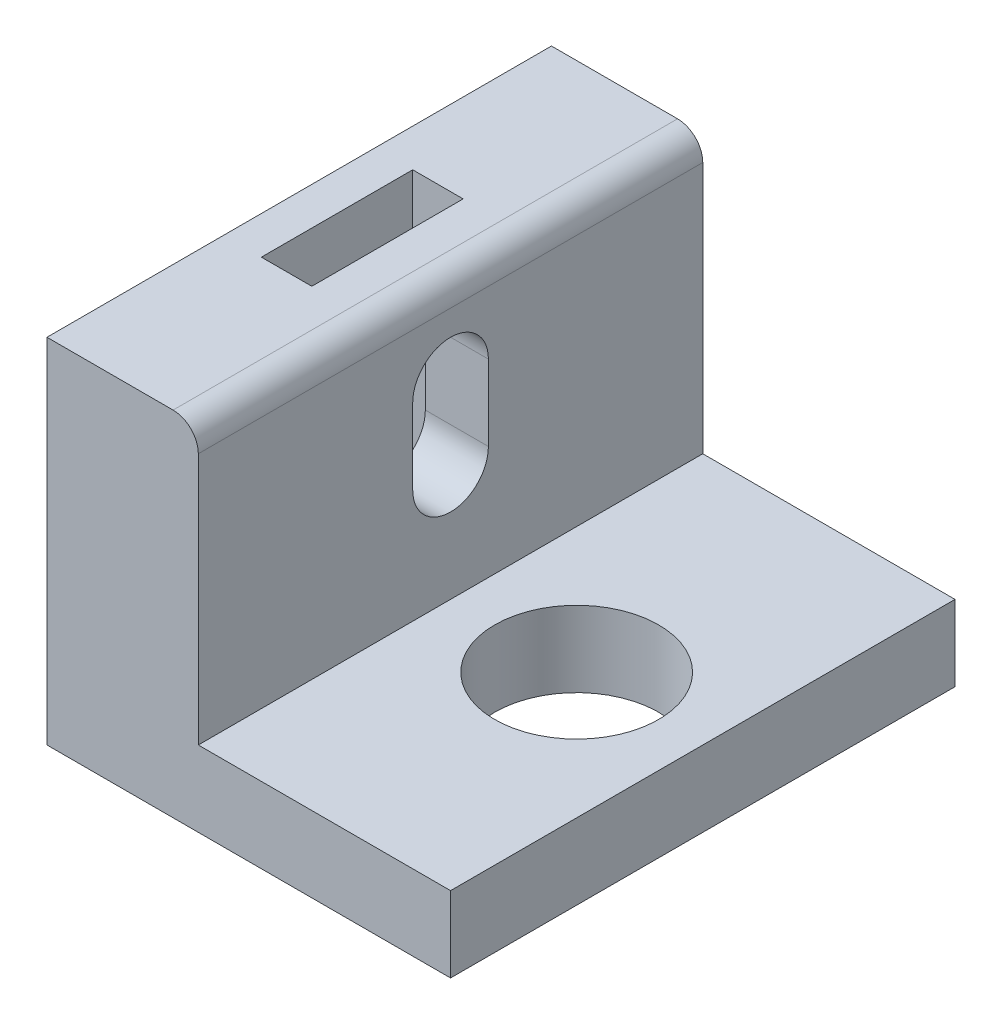
ISO-10303-21;
HEADER;
FILE_DESCRIPTION(('STEP AP214'),'2;1');
FILE_NAME('part.step','',(''),(''),'','','');
FILE_SCHEMA(('AUTOMOTIVE_DESIGN { 1 0 10303 214 1 1 1 1 }'));
ENDSEC;
DATA;
#1=APPLICATION_CONTEXT('core data for automotive mechanical design processes');
#2=APPLICATION_PROTOCOL_DEFINITION('international standard','automotive_design',2000,#1);
#3=PRODUCT_CONTEXT('',#1,'mechanical');
#4=PRODUCT('Part','Part','',(#3));
#5=PRODUCT_RELATED_PRODUCT_CATEGORY('part','',(#4));
#6=PRODUCT_DEFINITION_FORMATION('','',#4);
#7=PRODUCT_DEFINITION_CONTEXT('part definition',#1,'design');
#8=PRODUCT_DEFINITION('design','',#6,#7);
#9=PRODUCT_DEFINITION_SHAPE('','',#8);
#10=(LENGTH_UNIT() NAMED_UNIT(*) SI_UNIT(.MILLI.,.METRE.));
#11=(NAMED_UNIT(*) PLANE_ANGLE_UNIT() SI_UNIT($,.RADIAN.));
#12=(NAMED_UNIT(*) SI_UNIT($,.STERADIAN.) SOLID_ANGLE_UNIT());
#13=UNCERTAINTY_MEASURE_WITH_UNIT(LENGTH_MEASURE(1.E-05),#10,'distance_accuracy_value','');
#14=(GEOMETRIC_REPRESENTATION_CONTEXT(3) GLOBAL_UNCERTAINTY_ASSIGNED_CONTEXT((#13)) GLOBAL_UNIT_ASSIGNED_CONTEXT((#10,
#11,#12)) REPRESENTATION_CONTEXT('',''));
#15=CARTESIAN_POINT('',(0.,0.,0.));
#16=DIRECTION('',(0.,0.,1.));
#17=DIRECTION('',(1.,0.,0.));
#18=AXIS2_PLACEMENT_3D('',#15,#16,#17);
#19=CARTESIAN_POINT('',(7.501,20.,-10.));
#20=DIRECTION('',(-1.,0.,0.));
#21=DIRECTION('',(0.,0.,1.));
#22=AXIS2_PLACEMENT_3D('',#19,#20,#21);
#23=CYLINDRICAL_SURFACE('',#22,1.5);
#24=DIRECTION('',(-1.,0.,0.));
#25=VECTOR('',#24,1.);
#26=CARTESIAN_POINT('',(7.501,20.,-11.5));
#27=LINE('',#26,#25);
#28=CARTESIAN_POINT('',(-9.5,20.,-11.5));
#29=VERTEX_POINT('',#28);
#30=CARTESIAN_POINT('',(-11.,20.,-11.5));
#31=VERTEX_POINT('',#30);
#32=EDGE_CURVE('E199',#29,#31,#27,.T.);
#33=ORIENTED_EDGE('',*,*,#32,.F.);
#34=CARTESIAN_POINT('',(-9.5,20.,-10.));
#35=DIRECTION('',(-1.,0.,0.));
#36=DIRECTION('',(0.,0.,1.));
#37=AXIS2_PLACEMENT_3D('',#34,#35,#36);
#38=CIRCLE('',#37,1.5);
#39=CARTESIAN_POINT('',(-9.5,20.,-8.5));
#40=VERTEX_POINT('',#39);
#41=EDGE_CURVE('E194',#29,#40,#38,.F.);
#42=ORIENTED_EDGE('',*,*,#41,.T.);
#43=DIRECTION('',(-1.,0.,0.));
#44=VECTOR('',#43,1.);
#45=CARTESIAN_POINT('',(7.501,20.,-8.5));
#46=LINE('',#45,#44);
#47=CARTESIAN_POINT('',(-11.,20.,-8.5));
#48=VERTEX_POINT('',#47);
#49=EDGE_CURVE('E264',#40,#48,#46,.T.);
#50=ORIENTED_EDGE('',*,*,#49,.T.);
#51=CARTESIAN_POINT('',(-11.,20.,-10.));
#52=DIRECTION('',(-1.,0.,0.));
#53=DIRECTION('',(0.,0.,1.));
#54=AXIS2_PLACEMENT_3D('',#51,#52,#53);
#55=CIRCLE('',#54,1.5);
#56=EDGE_CURVE('E273',#48,#31,#55,.T.);
#57=ORIENTED_EDGE('',*,*,#56,.T.);
#58=EDGE_LOOP('',(#33,#42,#50,#57));
#59=FACE_BOUND('',#58,.T.);
#60=ADVANCED_FACE('F35',(#59),#23,.F.);
#61=CARTESIAN_POINT('',(7.501,20.,-8.5));
#62=DIRECTION('',(0.,0.,1.));
#63=DIRECTION('',(0.,-1.,0.));
#64=AXIS2_PLACEMENT_3D('',#61,#62,#63);
#65=PLANE('',#64);
#66=ORIENTED_EDGE('',*,*,#49,.F.);
#67=DIRECTION('',(0.,-1.,0.));
#68=VECTOR('',#67,1.);
#69=CARTESIAN_POINT('',(-9.5,20.,-8.5));
#70=LINE('',#69,#68);
#71=CARTESIAN_POINT('',(-9.5,17.,-8.49999999999999));
#72=VERTEX_POINT('',#71);
#73=EDGE_CURVE('E276',#40,#72,#70,.T.);
#74=ORIENTED_EDGE('',*,*,#73,.T.);
#75=DIRECTION('',(-1.,0.,0.));
#76=VECTOR('',#75,1.);
#77=CARTESIAN_POINT('',(7.501,17.,-8.5));
#78=LINE('',#77,#76);
#79=CARTESIAN_POINT('',(-11.,17.,-8.5));
#80=VERTEX_POINT('',#79);
#81=EDGE_CURVE('E261',#72,#80,#78,.T.);
#82=ORIENTED_EDGE('',*,*,#81,.T.);
#83=DIRECTION('',(0.,1.,0.));
#84=VECTOR('',#83,1.);
#85=CARTESIAN_POINT('',(-11.,20.,-8.5));
#86=LINE('',#85,#84);
#87=EDGE_CURVE('E265',#80,#48,#86,.T.);
#88=ORIENTED_EDGE('',*,*,#87,.T.);
#89=EDGE_LOOP('',(#66,#74,#82,#88));
#90=FACE_BOUND('',#89,.T.);
#91=ADVANCED_FACE('F362',(#90),#65,.F.);
#92=CARTESIAN_POINT('',(7.501,17.,-10.));
#93=DIRECTION('',(-1.,0.,0.));
#94=DIRECTION('',(0.,0.,1.));
#95=AXIS2_PLACEMENT_3D('',#92,#93,#94);
#96=CYLINDRICAL_SURFACE('',#95,1.5);
#97=ORIENTED_EDGE('',*,*,#81,.F.);
#98=CARTESIAN_POINT('',(-9.5,17.,-10.));
#99=DIRECTION('',(-1.,0.,0.));
#100=DIRECTION('',(0.,0.,1.));
#101=AXIS2_PLACEMENT_3D('',#98,#99,#100);
#102=CIRCLE('',#101,1.5);
#103=CARTESIAN_POINT('',(-9.5,17.,-11.5));
#104=VERTEX_POINT('',#103);
#105=EDGE_CURVE('E268',#72,#104,#102,.F.);
#106=ORIENTED_EDGE('',*,*,#105,.T.);
#107=DIRECTION('',(-1.,0.,0.));
#108=VECTOR('',#107,1.);
#109=CARTESIAN_POINT('',(7.501,17.,-11.5));
#110=LINE('',#109,#108);
#111=CARTESIAN_POINT('',(-11.,17.,-11.5));
#112=VERTEX_POINT('',#111);
#113=EDGE_CURVE('E256',#104,#112,#110,.T.);
#114=ORIENTED_EDGE('',*,*,#113,.T.);
#115=CARTESIAN_POINT('',(-11.,17.,-10.));
#116=DIRECTION('',(-1.,0.,0.));
#117=DIRECTION('',(0.,0.,1.));
#118=AXIS2_PLACEMENT_3D('',#115,#116,#117);
#119=CIRCLE('',#118,1.5);
#120=EDGE_CURVE('E200',#112,#80,#119,.T.);
#121=ORIENTED_EDGE('',*,*,#120,.T.);
#122=EDGE_LOOP('',(#97,#106,#114,#121));
#123=FACE_BOUND('',#122,.T.);
#124=ADVANCED_FACE('F367',(#123),#96,.F.);
#125=CARTESIAN_POINT('',(7.501,20.,-11.5));
#126=DIRECTION('',(0.,0.,-1.));
#127=DIRECTION('',(0.,1.,0.));
#128=AXIS2_PLACEMENT_3D('',#125,#126,#127);
#129=PLANE('',#128);
#130=ORIENTED_EDGE('',*,*,#113,.F.);
#131=DIRECTION('',(0.,1.,0.));
#132=VECTOR('',#131,1.);
#133=CARTESIAN_POINT('',(-9.5,20.,-11.5));
#134=LINE('',#133,#132);
#135=EDGE_CURVE('E196',#104,#29,#134,.T.);
#136=ORIENTED_EDGE('',*,*,#135,.T.);
#137=ORIENTED_EDGE('',*,*,#32,.T.);
#138=DIRECTION('',(0.,-1.,0.));
#139=VECTOR('',#138,1.);
#140=CARTESIAN_POINT('',(-11.,20.,-11.5));
#141=LINE('',#140,#139);
#142=EDGE_CURVE('E244',#31,#112,#141,.T.);
#143=ORIENTED_EDGE('',*,*,#142,.T.);
#144=EDGE_LOOP('',(#130,#136,#137,#143));
#145=FACE_BOUND('',#144,.T.);
#146=ADVANCED_FACE('F330',(#145),#129,.F.);
#147=CARTESIAN_POINT('',(-5.,12.5,-20.));
#148=DIRECTION('',(0.,1.,0.));
#149=DIRECTION('',(-1.,0.,0.));
#150=AXIS2_PLACEMENT_3D('',#147,#148,#149);
#151=PLANE('',#150);
#152=CARTESIAN_POINT('',(0.,12.5,-10.));
#153=DIRECTION('',(0.,1.,0.));
#154=DIRECTION('',(-1.,0.,0.));
#155=AXIS2_PLACEMENT_3D('',#152,#153,#154);
#156=CIRCLE('',#155,3.25);
#157=CARTESIAN_POINT('',(-3.25,12.5,-10.));
#158=VERTEX_POINT('',#157);
#159=EDGE_CURVE('E44',#158,#158,#156,.T.);
#160=ORIENTED_EDGE('',*,*,#159,.F.);
#161=EDGE_LOOP('',(#160));
#162=FACE_BOUND('',#161,.T.);
#163=DIRECTION('',(-1.,0.,0.));
#164=VECTOR('',#163,1.);
#165=CARTESIAN_POINT('',(-5.,12.5,0.));
#166=LINE('',#165,#164);
#167=CARTESIAN_POINT('',(5.00000000000001,12.5,0.));
#168=VERTEX_POINT('',#167);
#169=CARTESIAN_POINT('',(-5.,12.5,0.));
#170=VERTEX_POINT('',#169);
#171=EDGE_CURVE('E174',#168,#170,#166,.T.);
#172=ORIENTED_EDGE('',*,*,#171,.F.);
#173=DIRECTION('',(0.,0.,-1.));
#174=VECTOR('',#173,1.);
#175=CARTESIAN_POINT('',(5.,12.5,-20.));
#176=LINE('',#175,#174);
#177=CARTESIAN_POINT('',(5.,12.5,-20.));
#178=VERTEX_POINT('',#177);
#179=EDGE_CURVE('E183',#168,#178,#176,.T.);
#180=ORIENTED_EDGE('',*,*,#179,.T.);
#181=DIRECTION('',(-1.,0.,0.));
#182=VECTOR('',#181,1.);
#183=CARTESIAN_POINT('',(-5.,12.5,-20.));
#184=LINE('',#183,#182);
#185=CARTESIAN_POINT('',(-5.,12.5,-20.));
#186=VERTEX_POINT('',#185);
#187=EDGE_CURVE('E208',#178,#186,#184,.T.);
#188=ORIENTED_EDGE('',*,*,#187,.T.);
#189=DIRECTION('',(0.,0.,1.));
#190=VECTOR('',#189,1.);
#191=CARTESIAN_POINT('',(-5.,12.5,-20.));
#192=LINE('',#191,#190);
#193=EDGE_CURVE('E206',#186,#170,#192,.T.);
#194=ORIENTED_EDGE('',*,*,#193,.T.);
#195=EDGE_LOOP('',(#172,#180,#188,#194));
#196=FACE_BOUND('',#195,.T.);
#197=ADVANCED_FACE('F327',(#162,#196),#151,.T.);
#198=CARTESIAN_POINT('',(-4.00000000000456,9.5,-20.));
#199=DIRECTION('',(0.,-1.,0.));
#200=DIRECTION('',(0.,0.,-1.));
#201=AXIS2_PLACEMENT_3D('',#198,#199,#200);
#202=PLANE('',#201);
#203=DIRECTION('',(1.,0.,0.));
#204=VECTOR('',#203,1.);
#205=CARTESIAN_POINT('',(-4.00000000000456,9.5,0.));
#206=LINE('',#205,#204);
#207=CARTESIAN_POINT('',(-11.,9.5,0.));
#208=VERTEX_POINT('',#207);
#209=CARTESIAN_POINT('',(5.00000000000001,9.5,0.));
#210=VERTEX_POINT('',#209);
#211=EDGE_CURVE('E163',#208,#210,#206,.T.);
#212=ORIENTED_EDGE('',*,*,#211,.F.);
#213=DIRECTION('',(0.,0.,1.));
#214=VECTOR('',#213,1.);
#215=CARTESIAN_POINT('',(-11.,9.5,-20.));
#216=LINE('',#215,#214);
#217=CARTESIAN_POINT('',(-11.,9.5,-20.));
#218=VERTEX_POINT('',#217);
#219=EDGE_CURVE('E218',#218,#208,#216,.T.);
#220=ORIENTED_EDGE('',*,*,#219,.F.);
#221=DIRECTION('',(1.,0.,0.));
#222=VECTOR('',#221,1.);
#223=CARTESIAN_POINT('',(-4.00000000000456,9.5,-20.));
#224=LINE('',#223,#222);
#225=CARTESIAN_POINT('',(5.,9.5,-20.));
#226=VERTEX_POINT('',#225);
#227=EDGE_CURVE('E189',#218,#226,#224,.T.);
#228=ORIENTED_EDGE('',*,*,#227,.T.);
#229=DIRECTION('',(0.,0.,-1.));
#230=VECTOR('',#229,1.);
#231=CARTESIAN_POINT('',(5.,9.5,-20.));
#232=LINE('',#231,#230);
#233=EDGE_CURVE('E181',#210,#226,#232,.T.);
#234=ORIENTED_EDGE('',*,*,#233,.F.);
#235=EDGE_LOOP('',(#212,#220,#228,#234));
#236=FACE_BOUND('',#235,.T.);
#237=CARTESIAN_POINT('',(0.,9.5,-10.));
#238=DIRECTION('',(0.,1.,0.));
#239=DIRECTION('',(-1.,0.,0.));
#240=AXIS2_PLACEMENT_3D('',#237,#238,#239);
#241=CIRCLE('',#240,3.25);
#242=CARTESIAN_POINT('',(-3.25,9.5,-10.));
#243=VERTEX_POINT('',#242);
#244=EDGE_CURVE('E11',#243,#243,#241,.T.);
#245=ORIENTED_EDGE('',*,*,#244,.T.);
#246=EDGE_LOOP('',(#245));
#247=FACE_BOUND('',#246,.T.);
#248=ADVANCED_FACE('F186',(#236,#247),#202,.T.);
#249=CARTESIAN_POINT('',(-11.,9.5,-20.));
#250=DIRECTION('',(-1.,0.,0.));
#251=DIRECTION('',(0.,-1.,0.));
#252=AXIS2_PLACEMENT_3D('',#249,#250,#251);
#253=PLANE('',#252);
#254=ORIENTED_EDGE('',*,*,#56,.F.);
#255=ORIENTED_EDGE('',*,*,#87,.F.);
#256=ORIENTED_EDGE('',*,*,#120,.F.);
#257=ORIENTED_EDGE('',*,*,#142,.F.);
#258=EDGE_LOOP('',(#254,#255,#256,#257));
#259=FACE_BOUND('',#258,.T.);
#260=DIRECTION('',(0.,-1.,0.));
#261=VECTOR('',#260,1.);
#262=CARTESIAN_POINT('',(-11.,9.5,0.));
#263=LINE('',#262,#261);
#264=CARTESIAN_POINT('',(-11.,23.5,0.));
#265=VERTEX_POINT('',#264);
#266=EDGE_CURVE('E171',#265,#208,#263,.T.);
#267=ORIENTED_EDGE('',*,*,#266,.F.);
#268=DIRECTION('',(0.,0.,1.));
#269=VECTOR('',#268,1.);
#270=CARTESIAN_POINT('',(-11.,23.5,-20.));
#271=LINE('',#270,#269);
#272=CARTESIAN_POINT('',(-11.,23.5,-20.));
#273=VERTEX_POINT('',#272);
#274=EDGE_CURVE('E215',#273,#265,#271,.T.);
#275=ORIENTED_EDGE('',*,*,#274,.F.);
#276=DIRECTION('',(0.,-1.,0.));
#277=VECTOR('',#276,1.);
#278=CARTESIAN_POINT('',(-11.,9.5,-20.));
#279=LINE('',#278,#277);
#280=EDGE_CURVE('E219',#273,#218,#279,.T.);
#281=ORIENTED_EDGE('',*,*,#280,.T.);
#282=ORIENTED_EDGE('',*,*,#219,.T.);
#283=EDGE_LOOP('',(#267,#275,#281,#282));
#284=FACE_BOUND('',#283,.T.);
#285=ADVANCED_FACE('F346',(#259,#284),#253,.T.);
#286=CARTESIAN_POINT('',(-11.,23.5,-20.));
#287=DIRECTION('',(0.,1.,0.));
#288=DIRECTION('',(0.,0.,1.));
#289=AXIS2_PLACEMENT_3D('',#286,#287,#288);
#290=PLANE('',#289);
#291=DIRECTION('',(0.,0.,1.));
#292=VECTOR('',#291,1.);
#293=CARTESIAN_POINT('',(-9.5,23.5,-7.));
#294=LINE('',#293,#292);
#295=CARTESIAN_POINT('',(-9.5,23.5,-13.));
#296=VERTEX_POINT('',#295);
#297=CARTESIAN_POINT('',(-9.5,23.5,-7.));
#298=VERTEX_POINT('',#297);
#299=EDGE_CURVE('E204',#296,#298,#294,.T.);
#300=ORIENTED_EDGE('',*,*,#299,.F.);
#301=DIRECTION('',(-1.,0.,0.));
#302=VECTOR('',#301,1.);
#303=CARTESIAN_POINT('',(-7.5,23.5,-13.));
#304=LINE('',#303,#302);
#305=CARTESIAN_POINT('',(-7.5,23.5,-13.));
#306=VERTEX_POINT('',#305);
#307=EDGE_CURVE('E301',#306,#296,#304,.T.);
#308=ORIENTED_EDGE('',*,*,#307,.F.);
#309=DIRECTION('',(0.,0.,-1.));
#310=VECTOR('',#309,1.);
#311=CARTESIAN_POINT('',(-7.5,23.5,-7.));
#312=LINE('',#311,#310);
#313=CARTESIAN_POINT('',(-7.5,23.5,-7.));
#314=VERTEX_POINT('',#313);
#315=EDGE_CURVE('E302',#314,#306,#312,.T.);
#316=ORIENTED_EDGE('',*,*,#315,.F.);
#317=DIRECTION('',(1.,0.,0.));
#318=VECTOR('',#317,1.);
#319=CARTESIAN_POINT('',(-7.5,23.5,-7.));
#320=LINE('',#319,#318);
#321=EDGE_CURVE('E299',#298,#314,#320,.T.);
#322=ORIENTED_EDGE('',*,*,#321,.F.);
#323=EDGE_LOOP('',(#300,#308,#316,#322));
#324=FACE_BOUND('',#323,.T.);
#325=DIRECTION('',(-1.,0.,0.));
#326=VECTOR('',#325,1.);
#327=CARTESIAN_POINT('',(-11.,23.5,0.));
#328=LINE('',#327,#326);
#329=CARTESIAN_POINT('',(-6.,23.5,0.));
#330=VERTEX_POINT('',#329);
#331=EDGE_CURVE('E223',#330,#265,#328,.T.);
#332=ORIENTED_EDGE('',*,*,#331,.F.);
#333=DIRECTION('',(0.,0.,1.));
#334=VECTOR('',#333,1.);
#335=CARTESIAN_POINT('',(-6.,23.5,-20.));
#336=LINE('',#335,#334);
#337=CARTESIAN_POINT('',(-6.,23.5,-20.));
#338=VERTEX_POINT('',#337);
#339=EDGE_CURVE('E211',#338,#330,#336,.T.);
#340=ORIENTED_EDGE('',*,*,#339,.F.);
#341=DIRECTION('',(-1.,0.,0.));
#342=VECTOR('',#341,1.);
#343=CARTESIAN_POINT('',(-11.,23.5,-20.));
#344=LINE('',#343,#342);
#345=EDGE_CURVE('E217',#338,#273,#344,.T.);
#346=ORIENTED_EDGE('',*,*,#345,.T.);
#347=ORIENTED_EDGE('',*,*,#274,.T.);
#348=EDGE_LOOP('',(#332,#340,#346,#347));
#349=FACE_BOUND('',#348,.T.);
#350=ADVANCED_FACE('F343',(#324,#349),#290,.T.);
#351=CARTESIAN_POINT('',(-6.,22.5,-20.));
#352=DIRECTION('',(0.,0.,1.));
#353=DIRECTION('',(1.,0.,0.));
#354=AXIS2_PLACEMENT_3D('',#351,#352,#353);
#355=CYLINDRICAL_SURFACE('',#354,1.);
#356=CARTESIAN_POINT('',(-6.,22.5,0.));
#357=DIRECTION('',(0.,0.,1.));
#358=DIRECTION('',(-1.,0.,0.));
#359=AXIS2_PLACEMENT_3D('',#356,#357,#358);
#360=CIRCLE('',#359,1.);
#361=CARTESIAN_POINT('',(-5.,22.5,0.));
#362=VERTEX_POINT('',#361);
#363=EDGE_CURVE('E225',#362,#330,#360,.T.);
#364=ORIENTED_EDGE('',*,*,#363,.F.);
#365=DIRECTION('',(0.,0.,1.));
#366=VECTOR('',#365,1.);
#367=CARTESIAN_POINT('',(-5.,22.5,-20.));
#368=LINE('',#367,#366);
#369=CARTESIAN_POINT('',(-5.,22.5,-20.));
#370=VERTEX_POINT('',#369);
#371=EDGE_CURVE('E175',#370,#362,#368,.T.);
#372=ORIENTED_EDGE('',*,*,#371,.F.);
#373=CARTESIAN_POINT('',(-6.,22.5,-20.));
#374=DIRECTION('',(0.,0.,1.));
#375=DIRECTION('',(-1.,0.,0.));
#376=AXIS2_PLACEMENT_3D('',#373,#374,#375);
#377=CIRCLE('',#376,1.);
#378=EDGE_CURVE('E214',#370,#338,#377,.T.);
#379=ORIENTED_EDGE('',*,*,#378,.T.);
#380=ORIENTED_EDGE('',*,*,#339,.T.);
#381=EDGE_LOOP('',(#364,#372,#379,#380));
#382=FACE_BOUND('',#381,.T.);
#383=ADVANCED_FACE('F339',(#382),#355,.T.);
#384=CARTESIAN_POINT('',(-5.,22.5,-20.));
#385=DIRECTION('',(1.,0.,0.));
#386=DIRECTION('',(0.,0.,-1.));
#387=AXIS2_PLACEMENT_3D('',#384,#385,#386);
#388=PLANE('',#387);
#389=CARTESIAN_POINT('',(-5.,20.,-10.));
#390=DIRECTION('',(1.,0.,0.));
#391=DIRECTION('',(0.,0.,-1.));
#392=AXIS2_PLACEMENT_3D('',#389,#390,#391);
#393=CIRCLE('',#392,1.5);
#394=CARTESIAN_POINT('',(-5.,20.,-8.5));
#395=VERTEX_POINT('',#394);
#396=CARTESIAN_POINT('',(-5.,20.,-11.5));
#397=VERTEX_POINT('',#396);
#398=EDGE_CURVE('E213',#395,#397,#393,.F.);
#399=ORIENTED_EDGE('',*,*,#398,.T.);
#400=DIRECTION('',(0.,-1.,0.));
#401=VECTOR('',#400,1.);
#402=CARTESIAN_POINT('',(-5.,20.,-11.5));
#403=LINE('',#402,#401);
#404=CARTESIAN_POINT('',(-5.,17.,-11.5));
#405=VERTEX_POINT('',#404);
#406=EDGE_CURVE('E245',#397,#405,#403,.T.);
#407=ORIENTED_EDGE('',*,*,#406,.T.);
#408=CARTESIAN_POINT('',(-5.,17.,-10.));
#409=DIRECTION('',(1.,0.,0.));
#410=DIRECTION('',(0.,0.,-1.));
#411=AXIS2_PLACEMENT_3D('',#408,#409,#410);
#412=CIRCLE('',#411,1.5);
#413=CARTESIAN_POINT('',(-5.,17.,-8.49999999999999));
#414=VERTEX_POINT('',#413);
#415=EDGE_CURVE('E248',#405,#414,#412,.F.);
#416=ORIENTED_EDGE('',*,*,#415,.T.);
#417=DIRECTION('',(0.,1.,0.));
#418=VECTOR('',#417,1.);
#419=CARTESIAN_POINT('',(-5.,20.,-8.5));
#420=LINE('',#419,#418);
#421=EDGE_CURVE('E241',#414,#395,#420,.T.);
#422=ORIENTED_EDGE('',*,*,#421,.T.);
#423=EDGE_LOOP('',(#399,#407,#416,#422));
#424=FACE_BOUND('',#423,.T.);
#425=DIRECTION('',(0.,1.,0.));
#426=VECTOR('',#425,1.);
#427=CARTESIAN_POINT('',(-5.,22.5,0.));
#428=LINE('',#427,#426);
#429=EDGE_CURVE('E228',#170,#362,#428,.T.);
#430=ORIENTED_EDGE('',*,*,#429,.F.);
#431=ORIENTED_EDGE('',*,*,#193,.F.);
#432=DIRECTION('',(0.,1.,0.));
#433=VECTOR('',#432,1.);
#434=CARTESIAN_POINT('',(-5.,22.5,-20.));
#435=LINE('',#434,#433);
#436=EDGE_CURVE('E210',#186,#370,#435,.T.);
#437=ORIENTED_EDGE('',*,*,#436,.T.);
#438=ORIENTED_EDGE('',*,*,#371,.T.);
#439=EDGE_LOOP('',(#430,#431,#437,#438));
#440=FACE_BOUND('',#439,.T.);
#441=ADVANCED_FACE('F335',(#424,#440),#388,.T.);
#442=CARTESIAN_POINT('',(-6.,22.5,-20.));
#443=DIRECTION('',(0.,0.,-1.));
#444=DIRECTION('',(-1.,0.,0.));
#445=AXIS2_PLACEMENT_3D('',#442,#443,#444);
#446=PLANE('',#445);
#447=ORIENTED_EDGE('',*,*,#187,.F.);
#448=DIRECTION('',(0.,1.,0.));
#449=VECTOR('',#448,1.);
#450=CARTESIAN_POINT('',(5.,9.5,-20.));
#451=LINE('',#450,#449);
#452=EDGE_CURVE('E184',#226,#178,#451,.T.);
#453=ORIENTED_EDGE('',*,*,#452,.F.);
#454=ORIENTED_EDGE('',*,*,#227,.F.);
#455=ORIENTED_EDGE('',*,*,#280,.F.);
#456=ORIENTED_EDGE('',*,*,#345,.F.);
#457=ORIENTED_EDGE('',*,*,#378,.F.);
#458=ORIENTED_EDGE('',*,*,#436,.F.);
#459=EDGE_LOOP('',(#447,#453,#454,#455,#456,#457,#458));
#460=FACE_BOUND('',#459,.T.);
#461=ADVANCED_FACE('F348',(#460),#446,.T.);
#462=CARTESIAN_POINT('',(-6.,22.5,0.));
#463=DIRECTION('',(0.,0.,-1.));
#464=DIRECTION('',(-1.,0.,0.));
#465=AXIS2_PLACEMENT_3D('',#462,#463,#464);
#466=PLANE('',#465);
#467=ORIENTED_EDGE('',*,*,#211,.T.);
#468=DIRECTION('',(0.,1.,0.));
#469=VECTOR('',#468,1.);
#470=CARTESIAN_POINT('',(5.00000000000001,9.5,0.));
#471=LINE('',#470,#469);
#472=EDGE_CURVE('E167',#210,#168,#471,.T.);
#473=ORIENTED_EDGE('',*,*,#472,.T.);
#474=ORIENTED_EDGE('',*,*,#171,.T.);
#475=ORIENTED_EDGE('',*,*,#429,.T.);
#476=ORIENTED_EDGE('',*,*,#363,.T.);
#477=ORIENTED_EDGE('',*,*,#331,.T.);
#478=ORIENTED_EDGE('',*,*,#266,.T.);
#479=EDGE_LOOP('',(#467,#473,#474,#475,#476,#477,#478));
#480=FACE_BOUND('',#479,.T.);
#481=ADVANCED_FACE('F165',(#480),#466,.F.);
#482=CARTESIAN_POINT('',(-7.5,20.,-8.5));
#483=VERTEX_POINT('',#482);
#484=EDGE_CURVE('E222',#395,#483,#46,.T.);
#485=ORIENTED_EDGE('',*,*,#484,.T.);
#486=CARTESIAN_POINT('',(-7.5,20.,-10.));
#487=DIRECTION('',(1.,0.,0.));
#488=DIRECTION('',(0.,0.,-1.));
#489=AXIS2_PLACEMENT_3D('',#486,#487,#488);
#490=CIRCLE('',#489,1.5);
#491=CARTESIAN_POINT('',(-7.5,20.,-11.5));
#492=VERTEX_POINT('',#491);
#493=EDGE_CURVE('E260',#483,#492,#490,.F.);
#494=ORIENTED_EDGE('',*,*,#493,.T.);
#495=EDGE_CURVE('E205',#397,#492,#27,.T.);
#496=ORIENTED_EDGE('',*,*,#495,.F.);
#497=ORIENTED_EDGE('',*,*,#398,.F.);
#498=EDGE_LOOP('',(#485,#494,#496,#497));
#499=FACE_BOUND('',#498,.T.);
#500=ADVANCED_FACE('F355',(#499),#23,.F.);
#501=CARTESIAN_POINT('',(-7.5,17.,-8.49999999999999));
#502=VERTEX_POINT('',#501);
#503=EDGE_CURVE('E257',#414,#502,#78,.T.);
#504=ORIENTED_EDGE('',*,*,#503,.T.);
#505=DIRECTION('',(0.,1.,0.));
#506=VECTOR('',#505,1.);
#507=CARTESIAN_POINT('',(-7.5,20.,-8.5));
#508=LINE('',#507,#506);
#509=EDGE_CURVE('E255',#502,#483,#508,.T.);
#510=ORIENTED_EDGE('',*,*,#509,.T.);
#511=ORIENTED_EDGE('',*,*,#484,.F.);
#512=ORIENTED_EDGE('',*,*,#421,.F.);
#513=EDGE_LOOP('',(#504,#510,#511,#512));
#514=FACE_BOUND('',#513,.T.);
#515=ADVANCED_FACE('F370',(#514),#65,.F.);
#516=CARTESIAN_POINT('',(-7.5,17.,-11.5));
#517=VERTEX_POINT('',#516);
#518=EDGE_CURVE('E252',#405,#517,#110,.T.);
#519=ORIENTED_EDGE('',*,*,#518,.T.);
#520=CARTESIAN_POINT('',(-7.5,17.,-10.));
#521=DIRECTION('',(1.,0.,0.));
#522=DIRECTION('',(0.,0.,-1.));
#523=AXIS2_PLACEMENT_3D('',#520,#521,#522);
#524=CIRCLE('',#523,1.5);
#525=EDGE_CURVE('E251',#517,#502,#524,.F.);
#526=ORIENTED_EDGE('',*,*,#525,.T.);
#527=ORIENTED_EDGE('',*,*,#503,.F.);
#528=ORIENTED_EDGE('',*,*,#415,.F.);
#529=EDGE_LOOP('',(#519,#526,#527,#528));
#530=FACE_BOUND('',#529,.T.);
#531=ADVANCED_FACE('F378',(#530),#96,.F.);
#532=ORIENTED_EDGE('',*,*,#495,.T.);
#533=DIRECTION('',(0.,-1.,0.));
#534=VECTOR('',#533,1.);
#535=CARTESIAN_POINT('',(-7.5,20.,-11.5));
#536=LINE('',#535,#534);
#537=EDGE_CURVE('E201',#492,#517,#536,.T.);
#538=ORIENTED_EDGE('',*,*,#537,.T.);
#539=ORIENTED_EDGE('',*,*,#518,.F.);
#540=ORIENTED_EDGE('',*,*,#406,.F.);
#541=EDGE_LOOP('',(#532,#538,#539,#540));
#542=FACE_BOUND('',#541,.T.);
#543=ADVANCED_FACE('F388',(#542),#129,.F.);
#544=CARTESIAN_POINT('',(-9.5,12.5,-7.));
#545=DIRECTION('',(-1.,0.,0.));
#546=DIRECTION('',(0.,0.,1.));
#547=AXIS2_PLACEMENT_3D('',#544,#545,#546);
#548=PLANE('',#547);
#549=ORIENTED_EDGE('',*,*,#299,.T.);
#550=DIRECTION('',(0.,1.,0.));
#551=VECTOR('',#550,1.);
#552=CARTESIAN_POINT('',(-9.5,12.5,-7.));
#553=LINE('',#552,#551);
#554=CARTESIAN_POINT('',(-9.5,12.5,-7.));
#555=VERTEX_POINT('',#554);
#556=EDGE_CURVE('E295',#555,#298,#553,.T.);
#557=ORIENTED_EDGE('',*,*,#556,.F.);
#558=DIRECTION('',(0.,0.,1.));
#559=VECTOR('',#558,1.);
#560=CARTESIAN_POINT('',(-9.5,12.5,-7.));
#561=LINE('',#560,#559);
#562=CARTESIAN_POINT('',(-9.5,12.5,-13.));
#563=VERTEX_POINT('',#562);
#564=EDGE_CURVE('E298',#563,#555,#561,.T.);
#565=ORIENTED_EDGE('',*,*,#564,.F.);
#566=DIRECTION('',(0.,1.,0.));
#567=VECTOR('',#566,1.);
#568=CARTESIAN_POINT('',(-9.5,12.5,-13.));
#569=LINE('',#568,#567);
#570=EDGE_CURVE('E305',#563,#296,#569,.T.);
#571=ORIENTED_EDGE('',*,*,#570,.T.);
#572=EDGE_LOOP('',(#549,#557,#565,#571));
#573=FACE_BOUND('',#572,.T.);
#574=ORIENTED_EDGE('',*,*,#135,.F.);
#575=ORIENTED_EDGE('',*,*,#105,.F.);
#576=ORIENTED_EDGE('',*,*,#73,.F.);
#577=ORIENTED_EDGE('',*,*,#41,.F.);
#578=EDGE_LOOP('',(#574,#575,#576,#577));
#579=FACE_BOUND('',#578,.T.);
#580=ADVANCED_FACE('F390',(#573,#579),#548,.F.);
#581=CARTESIAN_POINT('',(-7.5,12.5,-7.));
#582=DIRECTION('',(1.,0.,0.));
#583=DIRECTION('',(0.,0.,-1.));
#584=AXIS2_PLACEMENT_3D('',#581,#582,#583);
#585=PLANE('',#584);
#586=ORIENTED_EDGE('',*,*,#315,.T.);
#587=DIRECTION('',(0.,1.,0.));
#588=VECTOR('',#587,1.);
#589=CARTESIAN_POINT('',(-7.5,12.5,-13.));
#590=LINE('',#589,#588);
#591=CARTESIAN_POINT('',(-7.5,12.5,-13.));
#592=VERTEX_POINT('',#591);
#593=EDGE_CURVE('E303',#592,#306,#590,.T.);
#594=ORIENTED_EDGE('',*,*,#593,.F.);
#595=DIRECTION('',(0.,0.,-1.));
#596=VECTOR('',#595,1.);
#597=CARTESIAN_POINT('',(-7.5,12.5,-7.));
#598=LINE('',#597,#596);
#599=CARTESIAN_POINT('',(-7.5,12.5,-7.));
#600=VERTEX_POINT('',#599);
#601=EDGE_CURVE('E316',#600,#592,#598,.T.);
#602=ORIENTED_EDGE('',*,*,#601,.F.);
#603=DIRECTION('',(0.,1.,0.));
#604=VECTOR('',#603,1.);
#605=CARTESIAN_POINT('',(-7.5,12.5,-7.));
#606=LINE('',#605,#604);
#607=EDGE_CURVE('E51',#600,#314,#606,.T.);
#608=ORIENTED_EDGE('',*,*,#607,.T.);
#609=EDGE_LOOP('',(#586,#594,#602,#608));
#610=FACE_BOUND('',#609,.T.);
#611=ORIENTED_EDGE('',*,*,#509,.F.);
#612=ORIENTED_EDGE('',*,*,#525,.F.);
#613=ORIENTED_EDGE('',*,*,#537,.F.);
#614=ORIENTED_EDGE('',*,*,#493,.F.);
#615=EDGE_LOOP('',(#611,#612,#613,#614));
#616=FACE_BOUND('',#615,.T.);
#617=ADVANCED_FACE('F386',(#610,#616),#585,.F.);
#618=CARTESIAN_POINT('',(-7.5,12.5,-13.));
#619=DIRECTION('',(0.,0.,-1.));
#620=DIRECTION('',(-1.,0.,0.));
#621=AXIS2_PLACEMENT_3D('',#618,#619,#620);
#622=PLANE('',#621);
#623=ORIENTED_EDGE('',*,*,#307,.T.);
#624=ORIENTED_EDGE('',*,*,#570,.F.);
#625=DIRECTION('',(-1.,0.,0.));
#626=VECTOR('',#625,1.);
#627=CARTESIAN_POINT('',(-7.5,12.5,-13.));
#628=LINE('',#627,#626);
#629=EDGE_CURVE('E313',#592,#563,#628,.T.);
#630=ORIENTED_EDGE('',*,*,#629,.F.);
#631=ORIENTED_EDGE('',*,*,#593,.T.);
#632=EDGE_LOOP('',(#623,#624,#630,#631));
#633=FACE_BOUND('',#632,.T.);
#634=ADVANCED_FACE('F439',(#633),#622,.F.);
#635=CARTESIAN_POINT('',(-7.5,12.5,-7.));
#636=DIRECTION('',(0.,0.,1.));
#637=DIRECTION('',(1.,0.,0.));
#638=AXIS2_PLACEMENT_3D('',#635,#636,#637);
#639=PLANE('',#638);
#640=ORIENTED_EDGE('',*,*,#321,.T.);
#641=ORIENTED_EDGE('',*,*,#607,.F.);
#642=DIRECTION('',(1.,0.,0.));
#643=VECTOR('',#642,1.);
#644=CARTESIAN_POINT('',(-7.5,12.5,-7.));
#645=LINE('',#644,#643);
#646=EDGE_CURVE('E319',#555,#600,#645,.T.);
#647=ORIENTED_EDGE('',*,*,#646,.F.);
#648=ORIENTED_EDGE('',*,*,#556,.T.);
#649=EDGE_LOOP('',(#640,#641,#647,#648));
#650=FACE_BOUND('',#649,.T.);
#651=ADVANCED_FACE('F433',(#650),#639,.F.);
#652=CARTESIAN_POINT('',(0.,12.5,0.));
#653=DIRECTION('',(0.,1.,0.));
#654=DIRECTION('',(0.,0.,1.));
#655=AXIS2_PLACEMENT_3D('',#652,#653,#654);
#656=PLANE('',#655);
#657=ORIENTED_EDGE('',*,*,#564,.T.);
#658=ORIENTED_EDGE('',*,*,#646,.T.);
#659=ORIENTED_EDGE('',*,*,#601,.T.);
#660=ORIENTED_EDGE('',*,*,#629,.T.);
#661=EDGE_LOOP('',(#657,#658,#659,#660));
#662=FACE_BOUND('',#661,.T.);
#663=ADVANCED_FACE('F428',(#662),#656,.T.);
#664=CARTESIAN_POINT('',(0.,0.,-10.));
#665=DIRECTION('',(0.,1.,0.));
#666=DIRECTION('',(-1.,0.,0.));
#667=AXIS2_PLACEMENT_3D('',#664,#665,#666);
#668=CYLINDRICAL_SURFACE('',#667,3.25);
#669=ORIENTED_EDGE('',*,*,#244,.F.);
#670=EDGE_LOOP('',(#669));
#671=FACE_BOUND('',#670,.T.);
#672=ORIENTED_EDGE('',*,*,#159,.T.);
#673=EDGE_LOOP('',(#672));
#674=FACE_BOUND('',#673,.T.);
#675=ADVANCED_FACE('F37',(#671,#674),#668,.F.);
#676=CARTESIAN_POINT('',(5.,9.5,-20.));
#677=DIRECTION('',(1.,0.,0.));
#678=DIRECTION('',(0.,1.,0.));
#679=AXIS2_PLACEMENT_3D('',#676,#677,#678);
#680=PLANE('',#679);
#681=ORIENTED_EDGE('',*,*,#179,.F.);
#682=ORIENTED_EDGE('',*,*,#472,.F.);
#683=ORIENTED_EDGE('',*,*,#233,.T.);
#684=ORIENTED_EDGE('',*,*,#452,.T.);
#685=EDGE_LOOP('',(#681,#682,#683,#684));
#686=FACE_BOUND('',#685,.T.);
#687=ADVANCED_FACE('F179',(#686),#680,.T.);
#688=CLOSED_SHELL('',(#60,#91,#124,#146,#197,#248,#285,#350,#383,#441,#461,#481,#500,#515,#531,
#543,#580,#617,#634,#651,#663,#675,#687));
#689=MANIFOLD_SOLID_BREP('B2',#688);
#690=ADVANCED_BREP_SHAPE_REPRESENTATION('',(#18,#689),#14);
#691=SHAPE_DEFINITION_REPRESENTATION(#9,#690);
ENDSEC;
END-ISO-10303-21;
